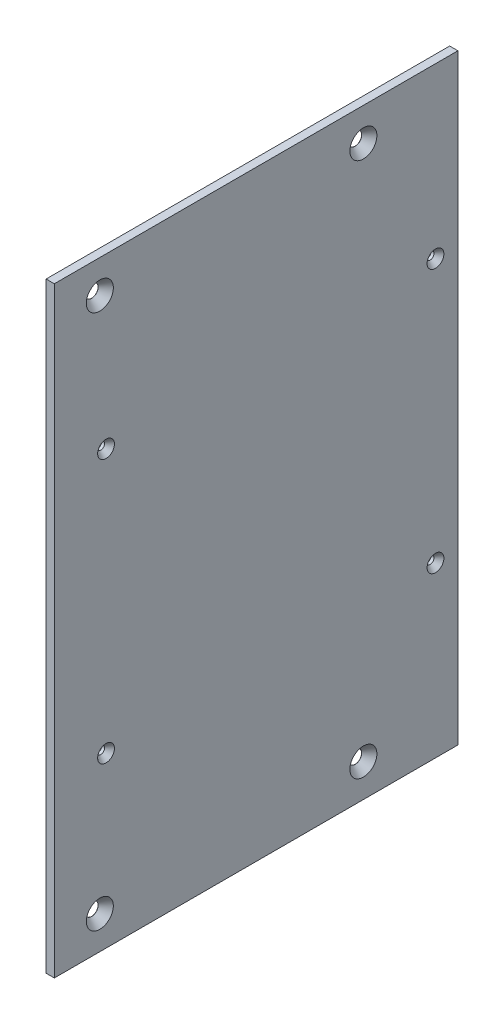
ISO-10303-21;
HEADER;
FILE_DESCRIPTION(('STEP AP214'),'2;1');
FILE_NAME('part.step','',(''),(''),'','','');
FILE_SCHEMA(('AUTOMOTIVE_DESIGN { 1 0 10303 214 1 1 1 1 }'));
ENDSEC;
DATA;
#1=APPLICATION_CONTEXT('core data for automotive mechanical design processes');
#2=APPLICATION_PROTOCOL_DEFINITION('international standard','automotive_design',2000,#1);
#3=PRODUCT_CONTEXT('',#1,'mechanical');
#4=PRODUCT('Part','Part','',(#3));
#5=PRODUCT_RELATED_PRODUCT_CATEGORY('part','',(#4));
#6=PRODUCT_DEFINITION_FORMATION('','',#4);
#7=PRODUCT_DEFINITION_CONTEXT('part definition',#1,'design');
#8=PRODUCT_DEFINITION('design','',#6,#7);
#9=PRODUCT_DEFINITION_SHAPE('','',#8);
#10=(LENGTH_UNIT() NAMED_UNIT(*) SI_UNIT(.MILLI.,.METRE.));
#11=(NAMED_UNIT(*) PLANE_ANGLE_UNIT() SI_UNIT($,.RADIAN.));
#12=(NAMED_UNIT(*) SI_UNIT($,.STERADIAN.) SOLID_ANGLE_UNIT());
#13=UNCERTAINTY_MEASURE_WITH_UNIT(LENGTH_MEASURE(1.E-05),#10,'distance_accuracy_value','');
#14=(GEOMETRIC_REPRESENTATION_CONTEXT(3) GLOBAL_UNCERTAINTY_ASSIGNED_CONTEXT((#13)) GLOBAL_UNIT_ASSIGNED_CONTEXT((#10,
#11,#12)) REPRESENTATION_CONTEXT('',''));
#15=CARTESIAN_POINT('',(0.,0.,0.));
#16=DIRECTION('',(0.,0.,1.));
#17=DIRECTION('',(1.,0.,0.));
#18=AXIS2_PLACEMENT_3D('',#15,#16,#17);
#19=CARTESIAN_POINT('',(19.05,0.,0.));
#20=DIRECTION('',(1.,0.,0.));
#21=DIRECTION('',(0.,1.,0.));
#22=AXIS2_PLACEMENT_3D('',#19,#20,#21);
#23=PLANE('',#22);
#24=CARTESIAN_POINT('',(19.0499999999998,-40.778028486811,160.910543981646));
#25=DIRECTION('',(1.,0.,0.));
#26=DIRECTION('',(0.,0.,-1.));
#27=AXIS2_PLACEMENT_3D('',#24,#25,#26);
#28=CIRCLE('',#27,1.47319999999999);
#29=CARTESIAN_POINT('',(19.0499999999998,-40.778028486811,159.437343981647));
#30=VERTEX_POINT('',#29);
#31=EDGE_CURVE('E177',#30,#30,#28,.T.);
#32=ORIENTED_EDGE('',*,*,#31,.T.);
#33=EDGE_LOOP('',(#32));
#34=FACE_BOUND('',#33,.T.);
#35=CARTESIAN_POINT('',(19.0499999999998,-142.378028486811,160.910543981646));
#36=DIRECTION('',(1.,0.,0.));
#37=DIRECTION('',(0.,0.,-1.));
#38=AXIS2_PLACEMENT_3D('',#35,#36,#37);
#39=CIRCLE('',#38,1.47320000000001);
#40=CARTESIAN_POINT('',(19.0499999999998,-142.378028486811,159.437343981647));
#41=VERTEX_POINT('',#40);
#42=EDGE_CURVE('E168',#41,#41,#39,.T.);
#43=ORIENTED_EDGE('',*,*,#42,.T.);
#44=EDGE_LOOP('',(#43));
#45=FACE_BOUND('',#44,.T.);
#46=CARTESIAN_POINT('',(19.0499999999998,-142.378028486811,33.9105439816469));
#47=DIRECTION('',(1.,0.,0.));
#48=DIRECTION('',(0.,0.,-1.));
#49=AXIS2_PLACEMENT_3D('',#46,#47,#48);
#50=CIRCLE('',#49,1.47320000000001);
#51=CARTESIAN_POINT('',(19.0499999999998,-142.378028486811,32.4373439816469));
#52=VERTEX_POINT('',#51);
#53=EDGE_CURVE('E159',#52,#52,#50,.T.);
#54=ORIENTED_EDGE('',*,*,#53,.T.);
#55=EDGE_LOOP('',(#54));
#56=FACE_BOUND('',#55,.T.);
#57=CARTESIAN_POINT('',(19.0499999999998,-40.778028486811,33.9105439816469));
#58=DIRECTION('',(1.,0.,0.));
#59=DIRECTION('',(0.,0.,-1.));
#60=AXIS2_PLACEMENT_3D('',#57,#58,#59);
#61=CIRCLE('',#60,1.47319999999999);
#62=CARTESIAN_POINT('',(19.0499999999998,-40.778028486811,32.4373439816469));
#63=VERTEX_POINT('',#62);
#64=EDGE_CURVE('E150',#63,#63,#61,.T.);
#65=ORIENTED_EDGE('',*,*,#64,.T.);
#66=EDGE_LOOP('',(#65));
#67=FACE_BOUND('',#66,.T.);
#68=CARTESIAN_POINT('',(19.05,-194.765528770403,163.300645754808));
#69=DIRECTION('',(-1.,0.,0.));
#70=DIRECTION('',(0.,0.,1.));
#71=AXIS2_PLACEMENT_3D('',#68,#69,#70);
#72=CIRCLE('',#71,2.4892);
#73=CARTESIAN_POINT('',(19.05,-194.765528770403,165.789845754808));
#74=VERTEX_POINT('',#73);
#75=EDGE_CURVE('E144',#74,#74,#72,.T.);
#76=ORIENTED_EDGE('',*,*,#75,.F.);
#77=EDGE_LOOP('',(#76));
#78=FACE_BOUND('',#77,.T.);
#79=CARTESIAN_POINT('',(19.05,11.6094717648979,61.7006457548084));
#80=DIRECTION('',(-1.,0.,0.));
#81=DIRECTION('',(0.,0.,1.));
#82=AXIS2_PLACEMENT_3D('',#79,#80,#81);
#83=CIRCLE('',#82,2.48919999999999);
#84=CARTESIAN_POINT('',(19.05,11.6094717648979,64.1898457548083));
#85=VERTEX_POINT('',#84);
#86=EDGE_CURVE('E126',#85,#85,#83,.T.);
#87=ORIENTED_EDGE('',*,*,#86,.F.);
#88=EDGE_LOOP('',(#87));
#89=FACE_BOUND('',#88,.T.);
#90=CARTESIAN_POINT('',(19.05,11.6094717648979,163.300645754808));
#91=DIRECTION('',(-1.,0.,0.));
#92=DIRECTION('',(0.,0.,1.));
#93=AXIS2_PLACEMENT_3D('',#90,#91,#92);
#94=CIRCLE('',#93,2.48919999999999);
#95=CARTESIAN_POINT('',(19.05,11.6094717648979,165.789845754808));
#96=VERTEX_POINT('',#95);
#97=EDGE_CURVE('E117',#96,#96,#94,.T.);
#98=ORIENTED_EDGE('',*,*,#97,.F.);
#99=EDGE_LOOP('',(#98));
#100=FACE_BOUND('',#99,.T.);
#101=DIRECTION('',(0.,0.,1.));
#102=VECTOR('',#101,1.);
#103=CARTESIAN_POINT('',(19.05,24.3094717648979,25.2650178388084));
#104=LINE('',#103,#102);
#105=CARTESIAN_POINT('',(19.05,24.3094717648979,25.2650178388084));
#106=VERTEX_POINT('',#105);
#107=CARTESIAN_POINT('',(19.05,24.3094717648979,180.840017838808));
#108=VERTEX_POINT('',#107);
#109=EDGE_CURVE('E101',#106,#108,#104,.T.);
#110=ORIENTED_EDGE('',*,*,#109,.F.);
#111=DIRECTION('',(0.,1.,0.));
#112=VECTOR('',#111,1.);
#113=CARTESIAN_POINT('',(19.05,-207.465528738517,25.2650178388084));
#114=LINE('',#113,#112);
#115=CARTESIAN_POINT('',(19.05,-207.465528738517,25.2650178388084));
#116=VERTEX_POINT('',#115);
#117=EDGE_CURVE('E77',#116,#106,#114,.T.);
#118=ORIENTED_EDGE('',*,*,#117,.F.);
#119=DIRECTION('',(0.,0.,-1.));
#120=VECTOR('',#119,1.);
#121=CARTESIAN_POINT('',(19.05,-207.465528738518,180.840017838808));
#122=LINE('',#121,#120);
#123=CARTESIAN_POINT('',(19.05,-207.465528738518,180.840017838808));
#124=VERTEX_POINT('',#123);
#125=EDGE_CURVE('E71',#124,#116,#122,.T.);
#126=ORIENTED_EDGE('',*,*,#125,.F.);
#127=DIRECTION('',(0.,-1.,0.));
#128=VECTOR('',#127,1.);
#129=CARTESIAN_POINT('',(19.05,24.3094717648979,180.840017838808));
#130=LINE('',#129,#128);
#131=EDGE_CURVE('E93',#108,#124,#130,.T.);
#132=ORIENTED_EDGE('',*,*,#131,.F.);
#133=EDGE_LOOP('',(#110,#118,#126,#132));
#134=FACE_BOUND('',#133,.T.);
#135=CARTESIAN_POINT('',(19.05,-194.765528770403,61.7006457548084));
#136=DIRECTION('',(-1.,0.,0.));
#137=DIRECTION('',(0.,0.,1.));
#138=AXIS2_PLACEMENT_3D('',#135,#136,#137);
#139=CIRCLE('',#138,2.4892);
#140=CARTESIAN_POINT('',(19.05,-194.765528770403,64.1898457548084));
#141=VERTEX_POINT('',#140);
#142=EDGE_CURVE('E135',#141,#141,#139,.T.);
#143=ORIENTED_EDGE('',*,*,#142,.F.);
#144=EDGE_LOOP('',(#143));
#145=FACE_BOUND('',#144,.T.);
#146=ADVANCED_FACE('F37',(#34,#45,#56,#67,#78,#89,#100,#134,#145),#23,.F.);
#147=CARTESIAN_POINT('',(22.225,24.3094717648979,25.2650178388084));
#148=DIRECTION('',(0.,-1.,0.));
#149=DIRECTION('',(1.,0.,0.));
#150=AXIS2_PLACEMENT_3D('',#147,#148,#149);
#151=PLANE('',#150);
#152=ORIENTED_EDGE('',*,*,#109,.T.);
#153=DIRECTION('',(-1.,0.,0.));
#154=VECTOR('',#153,1.);
#155=CARTESIAN_POINT('',(22.225,24.3094717648979,180.840017838808));
#156=LINE('',#155,#154);
#157=CARTESIAN_POINT('',(22.225,24.3094717648979,180.840017838808));
#158=VERTEX_POINT('',#157);
#159=EDGE_CURVE('E11',#158,#108,#156,.T.);
#160=ORIENTED_EDGE('',*,*,#159,.F.);
#161=DIRECTION('',(0.,0.,1.));
#162=VECTOR('',#161,1.);
#163=CARTESIAN_POINT('',(22.225,24.3094717648979,25.2650178388084));
#164=LINE('',#163,#162);
#165=CARTESIAN_POINT('',(22.225,24.3094717648979,25.2650178388084));
#166=VERTEX_POINT('',#165);
#167=EDGE_CURVE('E89',#166,#158,#164,.T.);
#168=ORIENTED_EDGE('',*,*,#167,.F.);
#169=DIRECTION('',(-1.,0.,0.));
#170=VECTOR('',#169,1.);
#171=CARTESIAN_POINT('',(22.225,24.3094717648979,25.2650178388084));
#172=LINE('',#171,#170);
#173=EDGE_CURVE('E97',#166,#106,#172,.T.);
#174=ORIENTED_EDGE('',*,*,#173,.T.);
#175=EDGE_LOOP('',(#152,#160,#168,#174));
#176=FACE_BOUND('',#175,.T.);
#177=ADVANCED_FACE('F39',(#176),#151,.F.);
#178=CARTESIAN_POINT('',(22.225,24.3094717648979,180.840017838808));
#179=DIRECTION('',(0.,0.,-1.));
#180=DIRECTION('',(-1.,0.,0.));
#181=AXIS2_PLACEMENT_3D('',#178,#179,#180);
#182=PLANE('',#181);
#183=ORIENTED_EDGE('',*,*,#131,.T.);
#184=DIRECTION('',(-1.,0.,0.));
#185=VECTOR('',#184,1.);
#186=CARTESIAN_POINT('',(22.225,-207.465528738518,180.840017838808));
#187=LINE('',#186,#185);
#188=CARTESIAN_POINT('',(22.225,-207.465528738518,180.840017838808));
#189=VERTEX_POINT('',#188);
#190=EDGE_CURVE('E46',#189,#124,#187,.T.);
#191=ORIENTED_EDGE('',*,*,#190,.F.);
#192=DIRECTION('',(0.,-1.,0.));
#193=VECTOR('',#192,1.);
#194=CARTESIAN_POINT('',(22.225,24.3094717648979,180.840017838808));
#195=LINE('',#194,#193);
#196=EDGE_CURVE('E84',#158,#189,#195,.T.);
#197=ORIENTED_EDGE('',*,*,#196,.F.);
#198=ORIENTED_EDGE('',*,*,#159,.T.);
#199=EDGE_LOOP('',(#183,#191,#197,#198));
#200=FACE_BOUND('',#199,.T.);
#201=ADVANCED_FACE('F92',(#200),#182,.F.);
#202=CARTESIAN_POINT('',(22.225,-207.465528738518,180.840017838808));
#203=DIRECTION('',(0.,1.,0.));
#204=DIRECTION('',(0.,0.,1.));
#205=AXIS2_PLACEMENT_3D('',#202,#203,#204);
#206=PLANE('',#205);
#207=ORIENTED_EDGE('',*,*,#125,.T.);
#208=DIRECTION('',(-1.,0.,0.));
#209=VECTOR('',#208,1.);
#210=CARTESIAN_POINT('',(22.225,-207.465528738517,25.2650178388084));
#211=LINE('',#210,#209);
#212=CARTESIAN_POINT('',(22.225,-207.465528738517,25.2650178388084));
#213=VERTEX_POINT('',#212);
#214=EDGE_CURVE('E94',#213,#116,#211,.T.);
#215=ORIENTED_EDGE('',*,*,#214,.F.);
#216=DIRECTION('',(0.,0.,-1.));
#217=VECTOR('',#216,1.);
#218=CARTESIAN_POINT('',(22.225,-207.465528738518,180.840017838808));
#219=LINE('',#218,#217);
#220=EDGE_CURVE('E87',#189,#213,#219,.T.);
#221=ORIENTED_EDGE('',*,*,#220,.F.);
#222=ORIENTED_EDGE('',*,*,#190,.T.);
#223=EDGE_LOOP('',(#207,#215,#221,#222));
#224=FACE_BOUND('',#223,.T.);
#225=ADVANCED_FACE('F95',(#224),#206,.F.);
#226=CARTESIAN_POINT('',(22.225,-207.465528738517,25.2650178388084));
#227=DIRECTION('',(0.,0.,1.));
#228=DIRECTION('',(1.,0.,0.));
#229=AXIS2_PLACEMENT_3D('',#226,#227,#228);
#230=PLANE('',#229);
#231=ORIENTED_EDGE('',*,*,#117,.T.);
#232=ORIENTED_EDGE('',*,*,#173,.F.);
#233=DIRECTION('',(0.,1.,0.));
#234=VECTOR('',#233,1.);
#235=CARTESIAN_POINT('',(22.225,-207.465528738517,25.2650178388084));
#236=LINE('',#235,#234);
#237=EDGE_CURVE('E54',#213,#166,#236,.T.);
#238=ORIENTED_EDGE('',*,*,#237,.F.);
#239=ORIENTED_EDGE('',*,*,#214,.T.);
#240=EDGE_LOOP('',(#231,#232,#238,#239));
#241=FACE_BOUND('',#240,.T.);
#242=ADVANCED_FACE('F109',(#241),#230,.F.);
#243=CARTESIAN_POINT('',(22.225,0.,0.));
#244=DIRECTION('',(1.,0.,0.));
#245=DIRECTION('',(0.,1.,0.));
#246=AXIS2_PLACEMENT_3D('',#243,#244,#245);
#247=PLANE('',#246);
#248=CARTESIAN_POINT('',(22.225,-40.778028486811,160.910543981646));
#249=DIRECTION('',(1.,0.,0.));
#250=DIRECTION('',(0.,0.,-1.));
#251=AXIS2_PLACEMENT_3D('',#248,#249,#250);
#252=CIRCLE('',#251,3.2385);
#253=CARTESIAN_POINT('',(22.225,-40.778028486811,157.672043981647));
#254=VERTEX_POINT('',#253);
#255=EDGE_CURVE('E183',#254,#254,#252,.T.);
#256=ORIENTED_EDGE('',*,*,#255,.F.);
#257=EDGE_LOOP('',(#256));
#258=FACE_BOUND('',#257,.T.);
#259=CARTESIAN_POINT('',(22.225,-142.378028486811,160.910543981646));
#260=DIRECTION('',(1.,0.,0.));
#261=DIRECTION('',(0.,0.,-1.));
#262=AXIS2_PLACEMENT_3D('',#259,#260,#261);
#263=CIRCLE('',#262,3.23850000000001);
#264=CARTESIAN_POINT('',(22.225,-142.378028486811,157.672043981647));
#265=VERTEX_POINT('',#264);
#266=EDGE_CURVE('E174',#265,#265,#263,.T.);
#267=ORIENTED_EDGE('',*,*,#266,.F.);
#268=EDGE_LOOP('',(#267));
#269=FACE_BOUND('',#268,.T.);
#270=CARTESIAN_POINT('',(22.225,-142.378028486811,33.9105439816469));
#271=DIRECTION('',(1.,0.,0.));
#272=DIRECTION('',(0.,0.,-1.));
#273=AXIS2_PLACEMENT_3D('',#270,#271,#272);
#274=CIRCLE('',#273,3.23850000000001);
#275=CARTESIAN_POINT('',(22.225,-142.378028486811,30.6720439816469));
#276=VERTEX_POINT('',#275);
#277=EDGE_CURVE('E165',#276,#276,#274,.T.);
#278=ORIENTED_EDGE('',*,*,#277,.F.);
#279=EDGE_LOOP('',(#278));
#280=FACE_BOUND('',#279,.T.);
#281=CARTESIAN_POINT('',(22.225,-40.778028486811,33.9105439816469));
#282=DIRECTION('',(1.,0.,0.));
#283=DIRECTION('',(0.,0.,-1.));
#284=AXIS2_PLACEMENT_3D('',#281,#282,#283);
#285=CIRCLE('',#284,3.2385);
#286=CARTESIAN_POINT('',(22.225,-40.778028486811,30.6720439816469));
#287=VERTEX_POINT('',#286);
#288=EDGE_CURVE('E156',#287,#287,#285,.T.);
#289=ORIENTED_EDGE('',*,*,#288,.F.);
#290=EDGE_LOOP('',(#289));
#291=FACE_BOUND('',#290,.T.);
#292=CARTESIAN_POINT('',(22.225,-194.765528770403,163.300645754808));
#293=DIRECTION('',(-1.,0.,0.));
#294=DIRECTION('',(0.,0.,1.));
#295=AXIS2_PLACEMENT_3D('',#292,#293,#294);
#296=CIRCLE('',#295,5.20699999999999);
#297=CARTESIAN_POINT('',(22.225,-194.765528770403,168.507645754808));
#298=VERTEX_POINT('',#297);
#299=EDGE_CURVE('E147',#298,#298,#296,.T.);
#300=ORIENTED_EDGE('',*,*,#299,.T.);
#301=EDGE_LOOP('',(#300));
#302=FACE_BOUND('',#301,.T.);
#303=CARTESIAN_POINT('',(22.225,-194.765528770403,61.7006457548084));
#304=DIRECTION('',(-1.,0.,0.));
#305=DIRECTION('',(0.,0.,1.));
#306=AXIS2_PLACEMENT_3D('',#303,#304,#305);
#307=CIRCLE('',#306,5.20699999999999);
#308=CARTESIAN_POINT('',(22.225,-194.765528770403,66.9076457548084));
#309=VERTEX_POINT('',#308);
#310=EDGE_CURVE('E138',#309,#309,#307,.T.);
#311=ORIENTED_EDGE('',*,*,#310,.T.);
#312=EDGE_LOOP('',(#311));
#313=FACE_BOUND('',#312,.T.);
#314=CARTESIAN_POINT('',(22.225,11.6094717648979,61.7006457548084));
#315=DIRECTION('',(-1.,0.,0.));
#316=DIRECTION('',(0.,0.,1.));
#317=AXIS2_PLACEMENT_3D('',#314,#315,#316);
#318=CIRCLE('',#317,5.207);
#319=CARTESIAN_POINT('',(22.225,11.6094717648979,66.9076457548084));
#320=VERTEX_POINT('',#319);
#321=EDGE_CURVE('E129',#320,#320,#318,.T.);
#322=ORIENTED_EDGE('',*,*,#321,.T.);
#323=EDGE_LOOP('',(#322));
#324=FACE_BOUND('',#323,.T.);
#325=CARTESIAN_POINT('',(22.225,11.6094717648979,163.300645754808));
#326=DIRECTION('',(-1.,0.,0.));
#327=DIRECTION('',(0.,0.,1.));
#328=AXIS2_PLACEMENT_3D('',#325,#326,#327);
#329=CIRCLE('',#328,5.207);
#330=CARTESIAN_POINT('',(22.225,11.6094717648979,168.507645754808));
#331=VERTEX_POINT('',#330);
#332=EDGE_CURVE('E120',#331,#331,#329,.T.);
#333=ORIENTED_EDGE('',*,*,#332,.T.);
#334=EDGE_LOOP('',(#333));
#335=FACE_BOUND('',#334,.T.);
#336=ORIENTED_EDGE('',*,*,#167,.T.);
#337=ORIENTED_EDGE('',*,*,#196,.T.);
#338=ORIENTED_EDGE('',*,*,#220,.T.);
#339=ORIENTED_EDGE('',*,*,#237,.T.);
#340=EDGE_LOOP('',(#336,#337,#338,#339));
#341=FACE_BOUND('',#340,.T.);
#342=ADVANCED_FACE('F85',(#258,#269,#280,#291,#302,#313,#324,#335,#341),#247,.T.);
#343=CARTESIAN_POINT('',(19.0985287428547,11.6094717648979,163.300645754808));
#344=DIRECTION('',(1.,0.,0.));
#345=DIRECTION('',(0.,0.,-1.));
#346=AXIS2_PLACEMENT_3D('',#343,#344,#345);
#347=CONICAL_SURFACE('',#346,2.4892,0.715584993317674);
#348=ORIENTED_EDGE('',*,*,#332,.F.);
#349=EDGE_LOOP('',(#348));
#350=FACE_BOUND('',#349,.T.);
#351=CARTESIAN_POINT('',(19.0985287428547,11.6094717648979,163.300645754808));
#352=DIRECTION('',(-1.,0.,0.));
#353=DIRECTION('',(0.,0.,1.));
#354=AXIS2_PLACEMENT_3D('',#351,#352,#353);
#355=CIRCLE('',#354,2.4892);
#356=CARTESIAN_POINT('',(19.0985287428547,11.6094717648979,165.789845754808));
#357=VERTEX_POINT('',#356);
#358=EDGE_CURVE('E104',#357,#357,#355,.T.);
#359=ORIENTED_EDGE('',*,*,#358,.T.);
#360=EDGE_LOOP('',(#359));
#361=FACE_BOUND('',#360,.T.);
#362=ADVANCED_FACE('F191',(#350,#361),#347,.F.);
#363=CARTESIAN_POINT('',(19.05,11.6094717648979,163.300645754808));
#364=DIRECTION('',(-1.,0.,0.));
#365=DIRECTION('',(0.,0.,1.));
#366=AXIS2_PLACEMENT_3D('',#363,#364,#365);
#367=CYLINDRICAL_SURFACE('',#366,2.48919999999999);
#368=ORIENTED_EDGE('',*,*,#358,.F.);
#369=EDGE_LOOP('',(#368));
#370=FACE_BOUND('',#369,.T.);
#371=ORIENTED_EDGE('',*,*,#97,.T.);
#372=EDGE_LOOP('',(#371));
#373=FACE_BOUND('',#372,.T.);
#374=ADVANCED_FACE('F209',(#370,#373),#367,.F.);
#375=CARTESIAN_POINT('',(19.0985287428547,11.6094717648979,61.7006457548084));
#376=DIRECTION('',(1.,0.,0.));
#377=DIRECTION('',(0.,0.,-1.));
#378=AXIS2_PLACEMENT_3D('',#375,#376,#377);
#379=CONICAL_SURFACE('',#378,2.4892,0.715584993317674);
#380=ORIENTED_EDGE('',*,*,#321,.F.);
#381=EDGE_LOOP('',(#380));
#382=FACE_BOUND('',#381,.T.);
#383=CARTESIAN_POINT('',(19.0985287428547,11.6094717648979,61.7006457548084));
#384=DIRECTION('',(-1.,0.,0.));
#385=DIRECTION('',(0.,0.,1.));
#386=AXIS2_PLACEMENT_3D('',#383,#384,#385);
#387=CIRCLE('',#386,2.4892);
#388=CARTESIAN_POINT('',(19.0985287428547,11.6094717648979,64.1898457548083));
#389=VERTEX_POINT('',#388);
#390=EDGE_CURVE('E123',#389,#389,#387,.T.);
#391=ORIENTED_EDGE('',*,*,#390,.T.);
#392=EDGE_LOOP('',(#391));
#393=FACE_BOUND('',#392,.T.);
#394=ADVANCED_FACE('F215',(#382,#393),#379,.F.);
#395=CARTESIAN_POINT('',(19.05,11.6094717648979,61.7006457548084));
#396=DIRECTION('',(-1.,0.,0.));
#397=DIRECTION('',(0.,0.,1.));
#398=AXIS2_PLACEMENT_3D('',#395,#396,#397);
#399=CYLINDRICAL_SURFACE('',#398,2.48919999999999);
#400=ORIENTED_EDGE('',*,*,#390,.F.);
#401=EDGE_LOOP('',(#400));
#402=FACE_BOUND('',#401,.T.);
#403=ORIENTED_EDGE('',*,*,#86,.T.);
#404=EDGE_LOOP('',(#403));
#405=FACE_BOUND('',#404,.T.);
#406=ADVANCED_FACE('F262',(#402,#405),#399,.F.);
#407=CARTESIAN_POINT('',(19.0985287428547,-194.765528770403,61.7006457548084));
#408=DIRECTION('',(1.,0.,0.));
#409=DIRECTION('',(0.,0.,-1.));
#410=AXIS2_PLACEMENT_3D('',#407,#408,#409);
#411=CONICAL_SURFACE('',#410,2.4892,0.715584993317672);
#412=ORIENTED_EDGE('',*,*,#310,.F.);
#413=EDGE_LOOP('',(#412));
#414=FACE_BOUND('',#413,.T.);
#415=CARTESIAN_POINT('',(19.0985287428547,-194.765528770403,61.7006457548084));
#416=DIRECTION('',(-1.,0.,0.));
#417=DIRECTION('',(0.,0.,1.));
#418=AXIS2_PLACEMENT_3D('',#415,#416,#417);
#419=CIRCLE('',#418,2.4892);
#420=CARTESIAN_POINT('',(19.0985287428547,-194.765528770403,64.1898457548084));
#421=VERTEX_POINT('',#420);
#422=EDGE_CURVE('E132',#421,#421,#419,.T.);
#423=ORIENTED_EDGE('',*,*,#422,.T.);
#424=EDGE_LOOP('',(#423));
#425=FACE_BOUND('',#424,.T.);
#426=ADVANCED_FACE('F270',(#414,#425),#411,.F.);
#427=CARTESIAN_POINT('',(19.05,-194.765528770403,61.7006457548084));
#428=DIRECTION('',(-1.,0.,0.));
#429=DIRECTION('',(0.,0.,1.));
#430=AXIS2_PLACEMENT_3D('',#427,#428,#429);
#431=CYLINDRICAL_SURFACE('',#430,2.4892);
#432=ORIENTED_EDGE('',*,*,#422,.F.);
#433=EDGE_LOOP('',(#432));
#434=FACE_BOUND('',#433,.T.);
#435=ORIENTED_EDGE('',*,*,#142,.T.);
#436=EDGE_LOOP('',(#435));
#437=FACE_BOUND('',#436,.T.);
#438=ADVANCED_FACE('F278',(#434,#437),#431,.F.);
#439=CARTESIAN_POINT('',(19.0985287428547,-194.765528770403,163.300645754808));
#440=DIRECTION('',(1.,0.,0.));
#441=DIRECTION('',(0.,0.,-1.));
#442=AXIS2_PLACEMENT_3D('',#439,#440,#441);
#443=CONICAL_SURFACE('',#442,2.4892,0.715584993317672);
#444=ORIENTED_EDGE('',*,*,#299,.F.);
#445=EDGE_LOOP('',(#444));
#446=FACE_BOUND('',#445,.T.);
#447=CARTESIAN_POINT('',(19.0985287428547,-194.765528770403,163.300645754808));
#448=DIRECTION('',(-1.,0.,0.));
#449=DIRECTION('',(0.,0.,1.));
#450=AXIS2_PLACEMENT_3D('',#447,#448,#449);
#451=CIRCLE('',#450,2.4892);
#452=CARTESIAN_POINT('',(19.0985287428547,-194.765528770403,165.789845754808));
#453=VERTEX_POINT('',#452);
#454=EDGE_CURVE('E141',#453,#453,#451,.T.);
#455=ORIENTED_EDGE('',*,*,#454,.T.);
#456=EDGE_LOOP('',(#455));
#457=FACE_BOUND('',#456,.T.);
#458=ADVANCED_FACE('F286',(#446,#457),#443,.F.);
#459=CARTESIAN_POINT('',(19.05,-194.765528770403,163.300645754808));
#460=DIRECTION('',(-1.,0.,0.));
#461=DIRECTION('',(0.,0.,1.));
#462=AXIS2_PLACEMENT_3D('',#459,#460,#461);
#463=CYLINDRICAL_SURFACE('',#462,2.4892);
#464=ORIENTED_EDGE('',*,*,#454,.F.);
#465=EDGE_LOOP('',(#464));
#466=FACE_BOUND('',#465,.T.);
#467=ORIENTED_EDGE('',*,*,#75,.T.);
#468=EDGE_LOOP('',(#467));
#469=FACE_BOUND('',#468,.T.);
#470=ADVANCED_FACE('F294',(#466,#469),#463,.F.);
#471=CARTESIAN_POINT('',(22.225,-40.778028486811,33.9105439816469));
#472=DIRECTION('',(1.,0.,0.));
#473=DIRECTION('',(0.,0.,-1.));
#474=AXIS2_PLACEMENT_3D('',#471,#472,#473);
#475=CYLINDRICAL_SURFACE('',#474,1.47319999999999);
#476=ORIENTED_EDGE('',*,*,#64,.F.);
#477=EDGE_LOOP('',(#476));
#478=FACE_BOUND('',#477,.T.);
#479=CARTESIAN_POINT('',(20.1942546507328,-40.778028486811,33.9105439816469));
#480=DIRECTION('',(1.,0.,0.));
#481=DIRECTION('',(0.,0.,-1.));
#482=AXIS2_PLACEMENT_3D('',#479,#480,#481);
#483=CIRCLE('',#482,1.47319999999999);
#484=CARTESIAN_POINT('',(20.1942546507328,-40.778028486811,32.4373439816469));
#485=VERTEX_POINT('',#484);
#486=EDGE_CURVE('E153',#485,#485,#483,.T.);
#487=ORIENTED_EDGE('',*,*,#486,.T.);
#488=EDGE_LOOP('',(#487));
#489=FACE_BOUND('',#488,.T.);
#490=ADVANCED_FACE('F302',(#478,#489),#475,.F.);
#491=CARTESIAN_POINT('',(22.225,-40.778028486811,33.9105439816469));
#492=DIRECTION('',(1.,0.,0.));
#493=DIRECTION('',(0.,0.,-1.));
#494=AXIS2_PLACEMENT_3D('',#491,#492,#493);
#495=CONICAL_SURFACE('',#494,3.2385,0.715584993317677);
#496=ORIENTED_EDGE('',*,*,#486,.F.);
#497=EDGE_LOOP('',(#496));
#498=FACE_BOUND('',#497,.T.);
#499=ORIENTED_EDGE('',*,*,#288,.T.);
#500=EDGE_LOOP('',(#499));
#501=FACE_BOUND('',#500,.T.);
#502=ADVANCED_FACE('F309',(#498,#501),#495,.F.);
#503=CARTESIAN_POINT('',(22.225,-142.378028486811,33.9105439816469));
#504=DIRECTION('',(1.,0.,0.));
#505=DIRECTION('',(0.,0.,-1.));
#506=AXIS2_PLACEMENT_3D('',#503,#504,#505);
#507=CYLINDRICAL_SURFACE('',#506,1.47320000000001);
#508=ORIENTED_EDGE('',*,*,#53,.F.);
#509=EDGE_LOOP('',(#508));
#510=FACE_BOUND('',#509,.T.);
#511=CARTESIAN_POINT('',(20.1942546507328,-142.378028486811,33.9105439816469));
#512=DIRECTION('',(1.,0.,0.));
#513=DIRECTION('',(0.,0.,-1.));
#514=AXIS2_PLACEMENT_3D('',#511,#512,#513);
#515=CIRCLE('',#514,1.47320000000001);
#516=CARTESIAN_POINT('',(20.1942546507328,-142.378028486811,32.4373439816469));
#517=VERTEX_POINT('',#516);
#518=EDGE_CURVE('E162',#517,#517,#515,.T.);
#519=ORIENTED_EDGE('',*,*,#518,.T.);
#520=EDGE_LOOP('',(#519));
#521=FACE_BOUND('',#520,.T.);
#522=ADVANCED_FACE('F317',(#510,#521),#507,.F.);
#523=CARTESIAN_POINT('',(22.225,-142.378028486811,33.9105439816469));
#524=DIRECTION('',(1.,0.,0.));
#525=DIRECTION('',(0.,0.,-1.));
#526=AXIS2_PLACEMENT_3D('',#523,#524,#525);
#527=CONICAL_SURFACE('',#526,3.23850000000001,0.715584993317675);
#528=ORIENTED_EDGE('',*,*,#518,.F.);
#529=EDGE_LOOP('',(#528));
#530=FACE_BOUND('',#529,.T.);
#531=ORIENTED_EDGE('',*,*,#277,.T.);
#532=EDGE_LOOP('',(#531));
#533=FACE_BOUND('',#532,.T.);
#534=ADVANCED_FACE('F325',(#530,#533),#527,.F.);
#535=CARTESIAN_POINT('',(22.225,-142.378028486811,160.910543981646));
#536=DIRECTION('',(1.,0.,0.));
#537=DIRECTION('',(0.,0.,-1.));
#538=AXIS2_PLACEMENT_3D('',#535,#536,#537);
#539=CYLINDRICAL_SURFACE('',#538,1.47320000000001);
#540=ORIENTED_EDGE('',*,*,#42,.F.);
#541=EDGE_LOOP('',(#540));
#542=FACE_BOUND('',#541,.T.);
#543=CARTESIAN_POINT('',(20.1942546507328,-142.378028486811,160.910543981646));
#544=DIRECTION('',(1.,0.,0.));
#545=DIRECTION('',(0.,0.,-1.));
#546=AXIS2_PLACEMENT_3D('',#543,#544,#545);
#547=CIRCLE('',#546,1.47320000000001);
#548=CARTESIAN_POINT('',(20.1942546507328,-142.378028486811,159.437343981647));
#549=VERTEX_POINT('',#548);
#550=EDGE_CURVE('E171',#549,#549,#547,.T.);
#551=ORIENTED_EDGE('',*,*,#550,.T.);
#552=EDGE_LOOP('',(#551));
#553=FACE_BOUND('',#552,.T.);
#554=ADVANCED_FACE('F333',(#542,#553),#539,.F.);
#555=CARTESIAN_POINT('',(22.225,-142.378028486811,160.910543981646));
#556=DIRECTION('',(1.,0.,0.));
#557=DIRECTION('',(0.,0.,-1.));
#558=AXIS2_PLACEMENT_3D('',#555,#556,#557);
#559=CONICAL_SURFACE('',#558,3.23850000000001,0.715584993317675);
#560=ORIENTED_EDGE('',*,*,#550,.F.);
#561=EDGE_LOOP('',(#560));
#562=FACE_BOUND('',#561,.T.);
#563=ORIENTED_EDGE('',*,*,#266,.T.);
#564=EDGE_LOOP('',(#563));
#565=FACE_BOUND('',#564,.T.);
#566=ADVANCED_FACE('F341',(#562,#565),#559,.F.);
#567=CARTESIAN_POINT('',(22.225,-40.778028486811,160.910543981646));
#568=DIRECTION('',(1.,0.,0.));
#569=DIRECTION('',(0.,0.,-1.));
#570=AXIS2_PLACEMENT_3D('',#567,#568,#569);
#571=CYLINDRICAL_SURFACE('',#570,1.47319999999999);
#572=ORIENTED_EDGE('',*,*,#31,.F.);
#573=EDGE_LOOP('',(#572));
#574=FACE_BOUND('',#573,.T.);
#575=CARTESIAN_POINT('',(20.1942546507328,-40.778028486811,160.910543981646));
#576=DIRECTION('',(1.,0.,0.));
#577=DIRECTION('',(0.,0.,-1.));
#578=AXIS2_PLACEMENT_3D('',#575,#576,#577);
#579=CIRCLE('',#578,1.47319999999999);
#580=CARTESIAN_POINT('',(20.1942546507328,-40.778028486811,159.437343981647));
#581=VERTEX_POINT('',#580);
#582=EDGE_CURVE('E180',#581,#581,#579,.T.);
#583=ORIENTED_EDGE('',*,*,#582,.T.);
#584=EDGE_LOOP('',(#583));
#585=FACE_BOUND('',#584,.T.);
#586=ADVANCED_FACE('F349',(#574,#585),#571,.F.);
#587=CARTESIAN_POINT('',(22.225,-40.778028486811,160.910543981646));
#588=DIRECTION('',(1.,0.,0.));
#589=DIRECTION('',(0.,0.,-1.));
#590=AXIS2_PLACEMENT_3D('',#587,#588,#589);
#591=CONICAL_SURFACE('',#590,3.2385,0.715584993317677);
#592=ORIENTED_EDGE('',*,*,#582,.F.);
#593=EDGE_LOOP('',(#592));
#594=FACE_BOUND('',#593,.T.);
#595=ORIENTED_EDGE('',*,*,#255,.T.);
#596=EDGE_LOOP('',(#595));
#597=FACE_BOUND('',#596,.T.);
#598=ADVANCED_FACE('F187',(#594,#597),#591,.F.);
#599=CLOSED_SHELL('',(#146,#177,#201,#225,#242,#342,#362,#374,#394,#406,#426,#438,#458,#470,
#490,#502,#522,#534,#554,#566,#586,#598));
#600=MANIFOLD_SOLID_BREP('B2',#599);
#601=ADVANCED_BREP_SHAPE_REPRESENTATION('',(#18,#600),#14);
#602=SHAPE_DEFINITION_REPRESENTATION(#9,#601);
ENDSEC;
END-ISO-10303-21;
